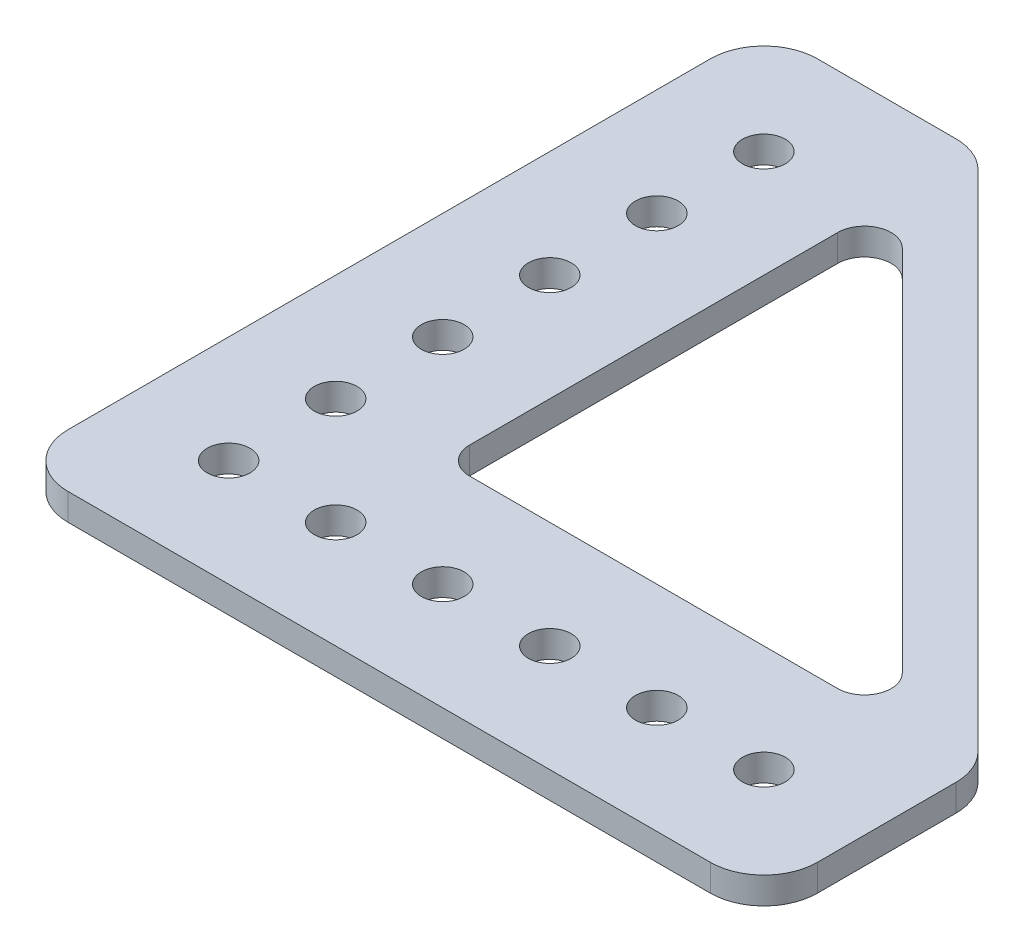
ISO-10303-21;
HEADER;
FILE_DESCRIPTION(('STEP AP214'),'2;1');
FILE_NAME('part.step','',(''),(''),'','','');
FILE_SCHEMA(('AUTOMOTIVE_DESIGN { 1 0 10303 214 1 1 1 1 }'));
ENDSEC;
DATA;
#1=APPLICATION_CONTEXT('core data for automotive mechanical design processes');
#2=APPLICATION_PROTOCOL_DEFINITION('international standard','automotive_design',2000,#1);
#3=PRODUCT_CONTEXT('',#1,'mechanical');
#4=PRODUCT('Part','Part','',(#3));
#5=PRODUCT_RELATED_PRODUCT_CATEGORY('part','',(#4));
#6=PRODUCT_DEFINITION_FORMATION('','',#4);
#7=PRODUCT_DEFINITION_CONTEXT('part definition',#1,'design');
#8=PRODUCT_DEFINITION('design','',#6,#7);
#9=PRODUCT_DEFINITION_SHAPE('','',#8);
#10=(LENGTH_UNIT() NAMED_UNIT(*) SI_UNIT(.MILLI.,.METRE.));
#11=(NAMED_UNIT(*) PLANE_ANGLE_UNIT() SI_UNIT($,.RADIAN.));
#12=(NAMED_UNIT(*) SI_UNIT($,.STERADIAN.) SOLID_ANGLE_UNIT());
#13=UNCERTAINTY_MEASURE_WITH_UNIT(LENGTH_MEASURE(1.E-05),#10,'distance_accuracy_value','');
#14=(GEOMETRIC_REPRESENTATION_CONTEXT(3) GLOBAL_UNCERTAINTY_ASSIGNED_CONTEXT((#13)) GLOBAL_UNIT_ASSIGNED_CONTEXT((#10,
#11,#12)) REPRESENTATION_CONTEXT('',''));
#15=CARTESIAN_POINT('',(0.,0.,0.));
#16=DIRECTION('',(0.,0.,1.));
#17=DIRECTION('',(1.,0.,0.));
#18=AXIS2_PLACEMENT_3D('',#15,#16,#17);
#19=CARTESIAN_POINT('',(0.,3.175,0.));
#20=DIRECTION('',(0.,1.,0.));
#21=DIRECTION('',(0.,0.,1.));
#22=AXIS2_PLACEMENT_3D('',#19,#20,#21);
#23=PLANE('',#22);
#24=CARTESIAN_POINT('',(12.7,3.175,-63.5));
#25=DIRECTION('',(0.,1.,0.));
#26=DIRECTION('',(0.,0.,1.));
#27=AXIS2_PLACEMENT_3D('',#24,#25,#26);
#28=CIRCLE('',#27,2.54);
#29=CARTESIAN_POINT('',(12.7,3.175,-60.96));
#30=VERTEX_POINT('',#29);
#31=EDGE_CURVE('E681',#30,#30,#28,.T.);
#32=ORIENTED_EDGE('',*,*,#31,.F.);
#33=EDGE_LOOP('',(#32));
#34=FACE_BOUND('',#33,.T.);
#35=CARTESIAN_POINT('',(12.7,3.175,-38.1));
#36=DIRECTION('',(0.,1.,0.));
#37=DIRECTION('',(0.,0.,1.));
#38=AXIS2_PLACEMENT_3D('',#35,#36,#37);
#39=CIRCLE('',#38,2.54);
#40=CARTESIAN_POINT('',(12.7,3.175,-35.56));
#41=VERTEX_POINT('',#40);
#42=EDGE_CURVE('E693',#41,#41,#39,.T.);
#43=ORIENTED_EDGE('',*,*,#42,.F.);
#44=EDGE_LOOP('',(#43));
#45=FACE_BOUND('',#44,.T.);
#46=CARTESIAN_POINT('',(76.2,3.175,-12.7));
#47=DIRECTION('',(0.,1.,0.));
#48=DIRECTION('',(0.,0.,1.));
#49=AXIS2_PLACEMENT_3D('',#46,#47,#48);
#50=CIRCLE('',#49,2.54);
#51=CARTESIAN_POINT('',(76.2,3.175,-10.16));
#52=VERTEX_POINT('',#51);
#53=EDGE_CURVE('E705',#52,#52,#50,.T.);
#54=ORIENTED_EDGE('',*,*,#53,.F.);
#55=EDGE_LOOP('',(#54));
#56=FACE_BOUND('',#55,.T.);
#57=CARTESIAN_POINT('',(50.8,3.175,-12.7));
#58=DIRECTION('',(0.,1.,0.));
#59=DIRECTION('',(0.,0.,1.));
#60=AXIS2_PLACEMENT_3D('',#57,#58,#59);
#61=CIRCLE('',#60,2.54);
#62=CARTESIAN_POINT('',(50.8,3.175,-10.16));
#63=VERTEX_POINT('',#62);
#64=EDGE_CURVE('E717',#63,#63,#61,.T.);
#65=ORIENTED_EDGE('',*,*,#64,.F.);
#66=EDGE_LOOP('',(#65));
#67=FACE_BOUND('',#66,.T.);
#68=CARTESIAN_POINT('',(25.4,3.175,-12.7));
#69=DIRECTION('',(0.,1.,0.));
#70=DIRECTION('',(0.,0.,1.));
#71=AXIS2_PLACEMENT_3D('',#68,#69,#70);
#72=CIRCLE('',#71,2.54);
#73=CARTESIAN_POINT('',(25.4,3.175,-10.16));
#74=VERTEX_POINT('',#73);
#75=EDGE_CURVE('E729',#74,#74,#72,.T.);
#76=ORIENTED_EDGE('',*,*,#75,.F.);
#77=EDGE_LOOP('',(#76));
#78=FACE_BOUND('',#77,.T.);
#79=DIRECTION('',(-0.707106781186548,0.,-0.707106781186548));
#80=VECTOR('',#79,1.);
#81=CARTESIAN_POINT('',(25.4,3.175,-79.9197438789308));
#82=LINE('',#81,#80);
#83=CARTESIAN_POINT('',(74.4996798486636,3.175,-30.8200640302673));
#84=VERTEX_POINT('',#83);
#85=CARTESIAN_POINT('',(30.8200640302673,3.175,-74.4996798486636));
#86=VERTEX_POINT('',#85);
#87=EDGE_CURVE('E194',#84,#86,#82,.T.);
#88=ORIENTED_EDGE('',*,*,#87,.F.);
#89=CARTESIAN_POINT('',(72.2546158183962,3.175,-28.575));
#90=DIRECTION('',(0.,1.,0.));
#91=DIRECTION('',(0.,0.,1.));
#92=AXIS2_PLACEMENT_3D('',#89,#90,#91);
#93=CIRCLE('',#92,3.175);
#94=CARTESIAN_POINT('',(72.2546158183962,3.175,-25.4));
#95=VERTEX_POINT('',#94);
#96=EDGE_CURVE('E262',#84,#95,#93,.F.);
#97=ORIENTED_EDGE('',*,*,#96,.T.);
#98=DIRECTION('',(1.,0.,0.));
#99=VECTOR('',#98,1.);
#100=CARTESIAN_POINT('',(25.4,3.175,-25.4));
#101=LINE('',#100,#99);
#102=CARTESIAN_POINT('',(28.575,3.175,-25.4));
#103=VERTEX_POINT('',#102);
#104=EDGE_CURVE('E275',#103,#95,#101,.T.);
#105=ORIENTED_EDGE('',*,*,#104,.F.);
#106=CARTESIAN_POINT('',(28.575,3.175,-28.575));
#107=DIRECTION('',(0.,1.,0.));
#108=DIRECTION('',(0.,0.,1.));
#109=AXIS2_PLACEMENT_3D('',#106,#107,#108);
#110=CIRCLE('',#109,3.175);
#111=CARTESIAN_POINT('',(25.4,3.175,-28.575));
#112=VERTEX_POINT('',#111);
#113=EDGE_CURVE('E258',#103,#112,#110,.F.);
#114=ORIENTED_EDGE('',*,*,#113,.T.);
#115=DIRECTION('',(0.,0.,1.));
#116=VECTOR('',#115,1.);
#117=CARTESIAN_POINT('',(25.4,3.175,-25.4));
#118=LINE('',#117,#116);
#119=CARTESIAN_POINT('',(25.4,3.175,-72.2546158183962));
#120=VERTEX_POINT('',#119);
#121=EDGE_CURVE('E187',#120,#112,#118,.T.);
#122=ORIENTED_EDGE('',*,*,#121,.F.);
#123=CARTESIAN_POINT('',(28.575,3.175,-72.2546158183963));
#124=DIRECTION('',(0.,1.,0.));
#125=DIRECTION('',(0.,0.,1.));
#126=AXIS2_PLACEMENT_3D('',#123,#124,#125);
#127=CIRCLE('',#126,3.175);
#128=EDGE_CURVE('E12',#120,#86,#127,.F.);
#129=ORIENTED_EDGE('',*,*,#128,.T.);
#130=EDGE_LOOP('',(#88,#97,#105,#114,#122,#129));
#131=FACE_BOUND('',#130,.T.);
#132=DIRECTION('',(0.,0.,1.));
#133=VECTOR('',#132,1.);
#134=CARTESIAN_POINT('',(0.,3.175,0.));
#135=LINE('',#134,#133);
#136=CARTESIAN_POINT('',(0.,3.175,-82.55));
#137=VERTEX_POINT('',#136);
#138=CARTESIAN_POINT('',(0.,3.175,-6.35));
#139=VERTEX_POINT('',#138);
#140=EDGE_CURVE('E197',#137,#139,#135,.T.);
#141=ORIENTED_EDGE('',*,*,#140,.T.);
#142=CARTESIAN_POINT('',(6.35,3.175,-6.35));
#143=DIRECTION('',(0.,1.,0.));
#144=DIRECTION('',(0.,0.,1.));
#145=AXIS2_PLACEMENT_3D('',#142,#143,#144);
#146=CIRCLE('',#145,6.35);
#147=CARTESIAN_POINT('',(6.35,3.175,0.));
#148=VERTEX_POINT('',#147);
#149=EDGE_CURVE('E225',#139,#148,#146,.T.);
#150=ORIENTED_EDGE('',*,*,#149,.T.);
#151=DIRECTION('',(1.,0.,0.));
#152=VECTOR('',#151,1.);
#153=CARTESIAN_POINT('',(0.,3.175,0.));
#154=LINE('',#153,#152);
#155=CARTESIAN_POINT('',(82.55,3.175,0.));
#156=VERTEX_POINT('',#155);
#157=EDGE_CURVE('E179',#148,#156,#154,.T.);
#158=ORIENTED_EDGE('',*,*,#157,.T.);
#159=CARTESIAN_POINT('',(82.55,3.175,-6.35));
#160=DIRECTION('',(0.,1.,0.));
#161=DIRECTION('',(0.,0.,1.));
#162=AXIS2_PLACEMENT_3D('',#159,#160,#161);
#163=CIRCLE('',#162,6.35);
#164=CARTESIAN_POINT('',(88.9,3.175,-6.35));
#165=VERTEX_POINT('',#164);
#166=EDGE_CURVE('E223',#156,#165,#163,.T.);
#167=ORIENTED_EDGE('',*,*,#166,.T.);
#168=DIRECTION('',(0.,0.,-1.));
#169=VECTOR('',#168,1.);
#170=CARTESIAN_POINT('',(88.9,3.175,0.));
#171=LINE('',#170,#169);
#172=CARTESIAN_POINT('',(88.9,3.175,-22.7697438789308));
#173=VERTEX_POINT('',#172);
#174=EDGE_CURVE('E290',#165,#173,#171,.T.);
#175=ORIENTED_EDGE('',*,*,#174,.T.);
#176=CARTESIAN_POINT('',(82.55,3.175,-22.7697438789308));
#177=DIRECTION('',(0.,1.,0.));
#178=DIRECTION('',(0.,0.,1.));
#179=AXIS2_PLACEMENT_3D('',#176,#177,#178);
#180=CIRCLE('',#179,6.35);
#181=CARTESIAN_POINT('',(87.0401280605346,3.175,-27.2598719394654));
#182=VERTEX_POINT('',#181);
#183=EDGE_CURVE('E221',#173,#182,#180,.T.);
#184=ORIENTED_EDGE('',*,*,#183,.T.);
#185=DIRECTION('',(-0.707106781186548,0.,-0.707106781186548));
#186=VECTOR('',#185,1.);
#187=CARTESIAN_POINT('',(25.4,3.175,-88.9));
#188=LINE('',#187,#186);
#189=CARTESIAN_POINT('',(27.2598719394654,3.175,-87.0401280605346));
#190=VERTEX_POINT('',#189);
#191=EDGE_CURVE('E292',#182,#190,#188,.T.);
#192=ORIENTED_EDGE('',*,*,#191,.T.);
#193=CARTESIAN_POINT('',(22.7697438789308,3.175,-82.55));
#194=DIRECTION('',(0.,1.,0.));
#195=DIRECTION('',(0.,0.,1.));
#196=AXIS2_PLACEMENT_3D('',#193,#194,#195);
#197=CIRCLE('',#196,6.35);
#198=CARTESIAN_POINT('',(22.7697438789308,3.175,-88.9));
#199=VERTEX_POINT('',#198);
#200=EDGE_CURVE('E219',#190,#199,#197,.T.);
#201=ORIENTED_EDGE('',*,*,#200,.T.);
#202=DIRECTION('',(-1.,0.,0.));
#203=VECTOR('',#202,1.);
#204=CARTESIAN_POINT('',(0.,3.175,-88.9));
#205=LINE('',#204,#203);
#206=CARTESIAN_POINT('',(6.35,3.175,-88.9));
#207=VERTEX_POINT('',#206);
#208=EDGE_CURVE('E296',#199,#207,#205,.T.);
#209=ORIENTED_EDGE('',*,*,#208,.T.);
#210=CARTESIAN_POINT('',(6.35,3.175,-82.55));
#211=DIRECTION('',(0.,1.,0.));
#212=DIRECTION('',(0.,0.,1.));
#213=AXIS2_PLACEMENT_3D('',#210,#211,#212);
#214=CIRCLE('',#213,6.35);
#215=EDGE_CURVE('E217',#207,#137,#214,.T.);
#216=ORIENTED_EDGE('',*,*,#215,.T.);
#217=EDGE_LOOP('',(#141,#150,#158,#167,#175,#184,#192,#201,#209,#216));
#218=FACE_BOUND('',#217,.T.);
#219=CARTESIAN_POINT('',(12.7,3.175,-12.7));
#220=DIRECTION('',(0.,1.,0.));
#221=DIRECTION('',(0.,0.,1.));
#222=AXIS2_PLACEMENT_3D('',#219,#220,#221);
#223=CIRCLE('',#222,2.54);
#224=CARTESIAN_POINT('',(12.7,3.175,-10.16));
#225=VERTEX_POINT('',#224);
#226=EDGE_CURVE('E287',#225,#225,#223,.T.);
#227=ORIENTED_EDGE('',*,*,#226,.F.);
#228=EDGE_LOOP('',(#227));
#229=FACE_BOUND('',#228,.T.);
#230=CARTESIAN_POINT('',(38.1,3.175,-12.7));
#231=DIRECTION('',(0.,1.,0.));
#232=DIRECTION('',(0.,0.,1.));
#233=AXIS2_PLACEMENT_3D('',#230,#231,#232);
#234=CIRCLE('',#233,2.54);
#235=CARTESIAN_POINT('',(38.1,3.175,-10.16));
#236=VERTEX_POINT('',#235);
#237=EDGE_CURVE('E723',#236,#236,#234,.T.);
#238=ORIENTED_EDGE('',*,*,#237,.F.);
#239=EDGE_LOOP('',(#238));
#240=FACE_BOUND('',#239,.T.);
#241=CARTESIAN_POINT('',(63.5,3.175,-12.7));
#242=DIRECTION('',(0.,1.,0.));
#243=DIRECTION('',(0.,0.,1.));
#244=AXIS2_PLACEMENT_3D('',#241,#242,#243);
#245=CIRCLE('',#244,2.54);
#246=CARTESIAN_POINT('',(63.5,3.175,-10.16));
#247=VERTEX_POINT('',#246);
#248=EDGE_CURVE('E711',#247,#247,#245,.T.);
#249=ORIENTED_EDGE('',*,*,#248,.F.);
#250=EDGE_LOOP('',(#249));
#251=FACE_BOUND('',#250,.T.);
#252=CARTESIAN_POINT('',(12.7,3.175,-25.4));
#253=DIRECTION('',(0.,1.,0.));
#254=DIRECTION('',(0.,0.,1.));
#255=AXIS2_PLACEMENT_3D('',#252,#253,#254);
#256=CIRCLE('',#255,2.54);
#257=CARTESIAN_POINT('',(12.7,3.175,-22.86));
#258=VERTEX_POINT('',#257);
#259=EDGE_CURVE('E699',#258,#258,#256,.T.);
#260=ORIENTED_EDGE('',*,*,#259,.F.);
#261=EDGE_LOOP('',(#260));
#262=FACE_BOUND('',#261,.T.);
#263=CARTESIAN_POINT('',(12.7,3.175,-50.8));
#264=DIRECTION('',(0.,1.,0.));
#265=DIRECTION('',(0.,0.,1.));
#266=AXIS2_PLACEMENT_3D('',#263,#264,#265);
#267=CIRCLE('',#266,2.54);
#268=CARTESIAN_POINT('',(12.7,3.175,-48.26));
#269=VERTEX_POINT('',#268);
#270=EDGE_CURVE('E687',#269,#269,#267,.T.);
#271=ORIENTED_EDGE('',*,*,#270,.F.);
#272=EDGE_LOOP('',(#271));
#273=FACE_BOUND('',#272,.T.);
#274=CARTESIAN_POINT('',(12.7,3.175,-76.2));
#275=DIRECTION('',(0.,1.,0.));
#276=DIRECTION('',(0.,0.,1.));
#277=AXIS2_PLACEMENT_3D('',#274,#275,#276);
#278=CIRCLE('',#277,2.54);
#279=CARTESIAN_POINT('',(12.7,3.175,-73.66));
#280=VERTEX_POINT('',#279);
#281=EDGE_CURVE('E672',#280,#280,#278,.T.);
#282=ORIENTED_EDGE('',*,*,#281,.F.);
#283=EDGE_LOOP('',(#282));
#284=FACE_BOUND('',#283,.T.);
#285=ADVANCED_FACE('F46',(#34,#45,#56,#67,#78,#131,#218,#229,#240,#251,#262,#273,#284),#23,.T.);
#286=CARTESIAN_POINT('',(0.,0.,0.));
#287=DIRECTION('',(0.,1.,0.));
#288=DIRECTION('',(0.,0.,1.));
#289=AXIS2_PLACEMENT_3D('',#286,#287,#288);
#290=PLANE('',#289);
#291=DIRECTION('',(1.,0.,0.));
#292=VECTOR('',#291,1.);
#293=CARTESIAN_POINT('',(0.,0.,0.));
#294=LINE('',#293,#292);
#295=CARTESIAN_POINT('',(6.35,0.,0.));
#296=VERTEX_POINT('',#295);
#297=CARTESIAN_POINT('',(82.55,0.,0.));
#298=VERTEX_POINT('',#297);
#299=EDGE_CURVE('E176',#296,#298,#294,.T.);
#300=ORIENTED_EDGE('',*,*,#299,.F.);
#301=CARTESIAN_POINT('',(6.35,0.,-6.35));
#302=DIRECTION('',(0.,1.,0.));
#303=DIRECTION('',(0.,0.,1.));
#304=AXIS2_PLACEMENT_3D('',#301,#302,#303);
#305=CIRCLE('',#304,6.35);
#306=CARTESIAN_POINT('',(0.,0.,-6.35));
#307=VERTEX_POINT('',#306);
#308=EDGE_CURVE('E159',#296,#307,#305,.F.);
#309=ORIENTED_EDGE('',*,*,#308,.T.);
#310=DIRECTION('',(0.,0.,1.));
#311=VECTOR('',#310,1.);
#312=CARTESIAN_POINT('',(0.,0.,0.));
#313=LINE('',#312,#311);
#314=CARTESIAN_POINT('',(0.,0.,-82.55));
#315=VERTEX_POINT('',#314);
#316=EDGE_CURVE('E205',#315,#307,#313,.T.);
#317=ORIENTED_EDGE('',*,*,#316,.F.);
#318=CARTESIAN_POINT('',(6.35,0.,-82.55));
#319=DIRECTION('',(0.,1.,0.));
#320=DIRECTION('',(0.,0.,1.));
#321=AXIS2_PLACEMENT_3D('',#318,#319,#320);
#322=CIRCLE('',#321,6.35);
#323=CARTESIAN_POINT('',(6.35,0.,-88.9));
#324=VERTEX_POINT('',#323);
#325=EDGE_CURVE('E180',#315,#324,#322,.F.);
#326=ORIENTED_EDGE('',*,*,#325,.T.);
#327=DIRECTION('',(-1.,0.,0.));
#328=VECTOR('',#327,1.);
#329=CARTESIAN_POINT('',(0.,0.,-88.9));
#330=LINE('',#329,#328);
#331=CARTESIAN_POINT('',(22.7697438789308,0.,-88.9));
#332=VERTEX_POINT('',#331);
#333=EDGE_CURVE('E202',#332,#324,#330,.T.);
#334=ORIENTED_EDGE('',*,*,#333,.F.);
#335=CARTESIAN_POINT('',(22.7697438789308,0.,-82.55));
#336=DIRECTION('',(0.,1.,0.));
#337=DIRECTION('',(0.,0.,1.));
#338=AXIS2_PLACEMENT_3D('',#335,#336,#337);
#339=CIRCLE('',#338,6.35);
#340=CARTESIAN_POINT('',(27.2598719394654,0.,-87.0401280605346));
#341=VERTEX_POINT('',#340);
#342=EDGE_CURVE('E209',#332,#341,#339,.F.);
#343=ORIENTED_EDGE('',*,*,#342,.T.);
#344=DIRECTION('',(-0.707106781186548,0.,-0.707106781186548));
#345=VECTOR('',#344,1.);
#346=CARTESIAN_POINT('',(25.4,0.,-88.9));
#347=LINE('',#346,#345);
#348=CARTESIAN_POINT('',(87.0401280605346,0.,-27.2598719394654));
#349=VERTEX_POINT('',#348);
#350=EDGE_CURVE('E190',#349,#341,#347,.T.);
#351=ORIENTED_EDGE('',*,*,#350,.F.);
#352=CARTESIAN_POINT('',(82.55,0.,-22.7697438789308));
#353=DIRECTION('',(0.,1.,0.));
#354=DIRECTION('',(0.,0.,1.));
#355=AXIS2_PLACEMENT_3D('',#352,#353,#354);
#356=CIRCLE('',#355,6.35);
#357=CARTESIAN_POINT('',(88.9,0.,-22.7697438789308));
#358=VERTEX_POINT('',#357);
#359=EDGE_CURVE('E211',#349,#358,#356,.F.);
#360=ORIENTED_EDGE('',*,*,#359,.T.);
#361=DIRECTION('',(0.,0.,-1.));
#362=VECTOR('',#361,1.);
#363=CARTESIAN_POINT('',(88.9,0.,0.));
#364=LINE('',#363,#362);
#365=CARTESIAN_POINT('',(88.9,0.,-6.35));
#366=VERTEX_POINT('',#365);
#367=EDGE_CURVE('E186',#366,#358,#364,.T.);
#368=ORIENTED_EDGE('',*,*,#367,.F.);
#369=CARTESIAN_POINT('',(82.55,0.,-6.35));
#370=DIRECTION('',(0.,1.,0.));
#371=DIRECTION('',(0.,0.,1.));
#372=AXIS2_PLACEMENT_3D('',#369,#370,#371);
#373=CIRCLE('',#372,6.35);
#374=EDGE_CURVE('E170',#366,#298,#373,.F.);
#375=ORIENTED_EDGE('',*,*,#374,.T.);
#376=EDGE_LOOP('',(#300,#309,#317,#326,#334,#343,#351,#360,#368,#375));
#377=FACE_BOUND('',#376,.T.);
#378=DIRECTION('',(0.,0.,1.));
#379=VECTOR('',#378,1.);
#380=CARTESIAN_POINT('',(25.4,0.,-25.4));
#381=LINE('',#380,#379);
#382=CARTESIAN_POINT('',(25.4,0.,-72.2546158183962));
#383=VERTEX_POINT('',#382);
#384=CARTESIAN_POINT('',(25.4,0.,-28.575));
#385=VERTEX_POINT('',#384);
#386=EDGE_CURVE('E267',#383,#385,#381,.T.);
#387=ORIENTED_EDGE('',*,*,#386,.T.);
#388=CARTESIAN_POINT('',(28.575,0.,-28.575));
#389=DIRECTION('',(0.,1.,0.));
#390=DIRECTION('',(0.,0.,1.));
#391=AXIS2_PLACEMENT_3D('',#388,#389,#390);
#392=CIRCLE('',#391,3.175);
#393=CARTESIAN_POINT('',(28.575,0.,-25.4));
#394=VERTEX_POINT('',#393);
#395=EDGE_CURVE('E256',#385,#394,#392,.T.);
#396=ORIENTED_EDGE('',*,*,#395,.T.);
#397=DIRECTION('',(1.,0.,0.));
#398=VECTOR('',#397,1.);
#399=CARTESIAN_POINT('',(25.4,0.,-25.4));
#400=LINE('',#399,#398);
#401=CARTESIAN_POINT('',(72.2546158183962,0.,-25.4));
#402=VERTEX_POINT('',#401);
#403=EDGE_CURVE('E284',#394,#402,#400,.T.);
#404=ORIENTED_EDGE('',*,*,#403,.T.);
#405=CARTESIAN_POINT('',(72.2546158183962,0.,-28.575));
#406=DIRECTION('',(0.,1.,0.));
#407=DIRECTION('',(0.,0.,1.));
#408=AXIS2_PLACEMENT_3D('',#405,#406,#407);
#409=CIRCLE('',#408,3.175);
#410=CARTESIAN_POINT('',(74.4996798486636,0.,-30.8200640302673));
#411=VERTEX_POINT('',#410);
#412=EDGE_CURVE('E260',#402,#411,#409,.T.);
#413=ORIENTED_EDGE('',*,*,#412,.T.);
#414=DIRECTION('',(-0.707106781186548,0.,-0.707106781186548));
#415=VECTOR('',#414,1.);
#416=CARTESIAN_POINT('',(25.4,0.,-79.9197438789308));
#417=LINE('',#416,#415);
#418=CARTESIAN_POINT('',(30.8200640302673,0.,-74.4996798486636));
#419=VERTEX_POINT('',#418);
#420=EDGE_CURVE('E268',#411,#419,#417,.T.);
#421=ORIENTED_EDGE('',*,*,#420,.T.);
#422=CARTESIAN_POINT('',(28.575,0.,-72.2546158183963));
#423=DIRECTION('',(0.,1.,0.));
#424=DIRECTION('',(0.,0.,1.));
#425=AXIS2_PLACEMENT_3D('',#422,#423,#424);
#426=CIRCLE('',#425,3.175);
#427=EDGE_CURVE('E54',#419,#383,#426,.T.);
#428=ORIENTED_EDGE('',*,*,#427,.T.);
#429=EDGE_LOOP('',(#387,#396,#404,#413,#421,#428));
#430=FACE_BOUND('',#429,.T.);
#431=CARTESIAN_POINT('',(12.7,0.,-12.7));
#432=DIRECTION('',(0.,1.,0.));
#433=DIRECTION('',(0.,0.,1.));
#434=AXIS2_PLACEMENT_3D('',#431,#432,#433);
#435=CIRCLE('',#434,2.54);
#436=CARTESIAN_POINT('',(12.7,0.,-10.16));
#437=VERTEX_POINT('',#436);
#438=EDGE_CURVE('E732',#437,#437,#435,.T.);
#439=ORIENTED_EDGE('',*,*,#438,.T.);
#440=EDGE_LOOP('',(#439));
#441=FACE_BOUND('',#440,.T.);
#442=CARTESIAN_POINT('',(25.4,0.,-12.7));
#443=DIRECTION('',(0.,1.,0.));
#444=DIRECTION('',(0.,0.,1.));
#445=AXIS2_PLACEMENT_3D('',#442,#443,#444);
#446=CIRCLE('',#445,2.54);
#447=CARTESIAN_POINT('',(25.4,0.,-10.16));
#448=VERTEX_POINT('',#447);
#449=EDGE_CURVE('E726',#448,#448,#446,.T.);
#450=ORIENTED_EDGE('',*,*,#449,.T.);
#451=EDGE_LOOP('',(#450));
#452=FACE_BOUND('',#451,.T.);
#453=CARTESIAN_POINT('',(38.1,0.,-12.7));
#454=DIRECTION('',(0.,1.,0.));
#455=DIRECTION('',(0.,0.,1.));
#456=AXIS2_PLACEMENT_3D('',#453,#454,#455);
#457=CIRCLE('',#456,2.54);
#458=CARTESIAN_POINT('',(38.1,0.,-10.16));
#459=VERTEX_POINT('',#458);
#460=EDGE_CURVE('E720',#459,#459,#457,.T.);
#461=ORIENTED_EDGE('',*,*,#460,.T.);
#462=EDGE_LOOP('',(#461));
#463=FACE_BOUND('',#462,.T.);
#464=CARTESIAN_POINT('',(50.8,0.,-12.7));
#465=DIRECTION('',(0.,1.,0.));
#466=DIRECTION('',(0.,0.,1.));
#467=AXIS2_PLACEMENT_3D('',#464,#465,#466);
#468=CIRCLE('',#467,2.54);
#469=CARTESIAN_POINT('',(50.8,0.,-10.16));
#470=VERTEX_POINT('',#469);
#471=EDGE_CURVE('E714',#470,#470,#468,.T.);
#472=ORIENTED_EDGE('',*,*,#471,.T.);
#473=EDGE_LOOP('',(#472));
#474=FACE_BOUND('',#473,.T.);
#475=CARTESIAN_POINT('',(63.5,0.,-12.7));
#476=DIRECTION('',(0.,1.,0.));
#477=DIRECTION('',(0.,0.,1.));
#478=AXIS2_PLACEMENT_3D('',#475,#476,#477);
#479=CIRCLE('',#478,2.54);
#480=CARTESIAN_POINT('',(63.5,0.,-10.16));
#481=VERTEX_POINT('',#480);
#482=EDGE_CURVE('E708',#481,#481,#479,.T.);
#483=ORIENTED_EDGE('',*,*,#482,.T.);
#484=EDGE_LOOP('',(#483));
#485=FACE_BOUND('',#484,.T.);
#486=CARTESIAN_POINT('',(76.2,0.,-12.7));
#487=DIRECTION('',(0.,1.,0.));
#488=DIRECTION('',(0.,0.,1.));
#489=AXIS2_PLACEMENT_3D('',#486,#487,#488);
#490=CIRCLE('',#489,2.54);
#491=CARTESIAN_POINT('',(76.2,0.,-10.16));
#492=VERTEX_POINT('',#491);
#493=EDGE_CURVE('E702',#492,#492,#490,.T.);
#494=ORIENTED_EDGE('',*,*,#493,.T.);
#495=EDGE_LOOP('',(#494));
#496=FACE_BOUND('',#495,.T.);
#497=CARTESIAN_POINT('',(12.7,0.,-25.4));
#498=DIRECTION('',(0.,1.,0.));
#499=DIRECTION('',(0.,0.,1.));
#500=AXIS2_PLACEMENT_3D('',#497,#498,#499);
#501=CIRCLE('',#500,2.54);
#502=CARTESIAN_POINT('',(12.7,0.,-22.86));
#503=VERTEX_POINT('',#502);
#504=EDGE_CURVE('E696',#503,#503,#501,.T.);
#505=ORIENTED_EDGE('',*,*,#504,.T.);
#506=EDGE_LOOP('',(#505));
#507=FACE_BOUND('',#506,.T.);
#508=CARTESIAN_POINT('',(12.7,0.,-38.1));
#509=DIRECTION('',(0.,1.,0.));
#510=DIRECTION('',(0.,0.,1.));
#511=AXIS2_PLACEMENT_3D('',#508,#509,#510);
#512=CIRCLE('',#511,2.54);
#513=CARTESIAN_POINT('',(12.7,0.,-35.56));
#514=VERTEX_POINT('',#513);
#515=EDGE_CURVE('E690',#514,#514,#512,.T.);
#516=ORIENTED_EDGE('',*,*,#515,.T.);
#517=EDGE_LOOP('',(#516));
#518=FACE_BOUND('',#517,.T.);
#519=CARTESIAN_POINT('',(12.7,0.,-50.8));
#520=DIRECTION('',(0.,1.,0.));
#521=DIRECTION('',(0.,0.,1.));
#522=AXIS2_PLACEMENT_3D('',#519,#520,#521);
#523=CIRCLE('',#522,2.54);
#524=CARTESIAN_POINT('',(12.7,0.,-48.26));
#525=VERTEX_POINT('',#524);
#526=EDGE_CURVE('E684',#525,#525,#523,.T.);
#527=ORIENTED_EDGE('',*,*,#526,.T.);
#528=EDGE_LOOP('',(#527));
#529=FACE_BOUND('',#528,.T.);
#530=CARTESIAN_POINT('',(12.7,0.,-63.5));
#531=DIRECTION('',(0.,1.,0.));
#532=DIRECTION('',(0.,0.,1.));
#533=AXIS2_PLACEMENT_3D('',#530,#531,#532);
#534=CIRCLE('',#533,2.54);
#535=CARTESIAN_POINT('',(12.7,0.,-60.96));
#536=VERTEX_POINT('',#535);
#537=EDGE_CURVE('E678',#536,#536,#534,.T.);
#538=ORIENTED_EDGE('',*,*,#537,.T.);
#539=EDGE_LOOP('',(#538));
#540=FACE_BOUND('',#539,.T.);
#541=CARTESIAN_POINT('',(12.7,0.,-76.2));
#542=DIRECTION('',(0.,1.,0.));
#543=DIRECTION('',(0.,0.,1.));
#544=AXIS2_PLACEMENT_3D('',#541,#542,#543);
#545=CIRCLE('',#544,2.54);
#546=CARTESIAN_POINT('',(12.7,0.,-73.66));
#547=VERTEX_POINT('',#546);
#548=EDGE_CURVE('E675',#547,#547,#545,.T.);
#549=ORIENTED_EDGE('',*,*,#548,.T.);
#550=EDGE_LOOP('',(#549));
#551=FACE_BOUND('',#550,.T.);
#552=ADVANCED_FACE('F183',(#377,#430,#441,#452,#463,#474,#485,#496,#507,#518,#529,#540,#551),
#290,.F.);
#553=CARTESIAN_POINT('',(0.,3.175,0.));
#554=DIRECTION('',(0.,0.,-1.));
#555=DIRECTION('',(-1.,0.,0.));
#556=AXIS2_PLACEMENT_3D('',#553,#554,#555);
#557=PLANE('',#556);
#558=ORIENTED_EDGE('',*,*,#157,.F.);
#559=DIRECTION('',(0.,-1.,0.));
#560=VECTOR('',#559,1.);
#561=CARTESIAN_POINT('',(6.35,3.175,0.));
#562=LINE('',#561,#560);
#563=EDGE_CURVE('E163',#148,#296,#562,.T.);
#564=ORIENTED_EDGE('',*,*,#563,.T.);
#565=ORIENTED_EDGE('',*,*,#299,.T.);
#566=DIRECTION('',(0.,-1.,0.));
#567=VECTOR('',#566,1.);
#568=CARTESIAN_POINT('',(82.55,3.175,0.));
#569=LINE('',#568,#567);
#570=EDGE_CURVE('E181',#298,#156,#569,.F.);
#571=ORIENTED_EDGE('',*,*,#570,.T.);
#572=EDGE_LOOP('',(#558,#564,#565,#571));
#573=FACE_BOUND('',#572,.T.);
#574=ADVANCED_FACE('F175',(#573),#557,.F.);
#575=CARTESIAN_POINT('',(88.9,3.175,0.));
#576=DIRECTION('',(-1.,0.,0.));
#577=DIRECTION('',(0.,0.,1.));
#578=AXIS2_PLACEMENT_3D('',#575,#576,#577);
#579=PLANE('',#578);
#580=ORIENTED_EDGE('',*,*,#174,.F.);
#581=DIRECTION('',(0.,-1.,0.));
#582=VECTOR('',#581,1.);
#583=CARTESIAN_POINT('',(88.9,3.175,-6.35));
#584=LINE('',#583,#582);
#585=EDGE_CURVE('E229',#165,#366,#584,.T.);
#586=ORIENTED_EDGE('',*,*,#585,.T.);
#587=ORIENTED_EDGE('',*,*,#367,.T.);
#588=DIRECTION('',(0.,-1.,0.));
#589=VECTOR('',#588,1.);
#590=CARTESIAN_POINT('',(88.9,3.175,-22.7697438789308));
#591=LINE('',#590,#589);
#592=EDGE_CURVE('E227',#358,#173,#591,.F.);
#593=ORIENTED_EDGE('',*,*,#592,.T.);
#594=EDGE_LOOP('',(#580,#586,#587,#593));
#595=FACE_BOUND('',#594,.T.);
#596=ADVANCED_FACE('F329',(#595),#579,.F.);
#597=CARTESIAN_POINT('',(25.4,3.175,-88.9));
#598=DIRECTION('',(-0.707106781186548,0.,0.707106781186548));
#599=DIRECTION('',(0.707106781186548,0.,0.707106781186548));
#600=AXIS2_PLACEMENT_3D('',#597,#598,#599);
#601=PLANE('',#600);
#602=ORIENTED_EDGE('',*,*,#191,.F.);
#603=DIRECTION('',(0.,-1.,0.));
#604=VECTOR('',#603,1.);
#605=CARTESIAN_POINT('',(87.0401280605346,3.175,-27.2598719394654));
#606=LINE('',#605,#604);
#607=EDGE_CURVE('E234',#182,#349,#606,.T.);
#608=ORIENTED_EDGE('',*,*,#607,.T.);
#609=ORIENTED_EDGE('',*,*,#350,.T.);
#610=DIRECTION('',(0.,-1.,0.));
#611=VECTOR('',#610,1.);
#612=CARTESIAN_POINT('',(27.2598719394654,3.175,-87.0401280605346));
#613=LINE('',#612,#611);
#614=EDGE_CURVE('E232',#341,#190,#613,.F.);
#615=ORIENTED_EDGE('',*,*,#614,.T.);
#616=EDGE_LOOP('',(#602,#608,#609,#615));
#617=FACE_BOUND('',#616,.T.);
#618=ADVANCED_FACE('F321',(#617),#601,.F.);
#619=CARTESIAN_POINT('',(0.,3.175,-88.9));
#620=DIRECTION('',(0.,0.,1.));
#621=DIRECTION('',(1.,0.,0.));
#622=AXIS2_PLACEMENT_3D('',#619,#620,#621);
#623=PLANE('',#622);
#624=ORIENTED_EDGE('',*,*,#208,.F.);
#625=DIRECTION('',(0.,-1.,0.));
#626=VECTOR('',#625,1.);
#627=CARTESIAN_POINT('',(22.7697438789308,3.175,-88.9));
#628=LINE('',#627,#626);
#629=EDGE_CURVE('E239',#199,#332,#628,.T.);
#630=ORIENTED_EDGE('',*,*,#629,.T.);
#631=ORIENTED_EDGE('',*,*,#333,.T.);
#632=DIRECTION('',(0.,-1.,0.));
#633=VECTOR('',#632,1.);
#634=CARTESIAN_POINT('',(6.35,3.175,-88.9));
#635=LINE('',#634,#633);
#636=EDGE_CURVE('E237',#324,#207,#635,.F.);
#637=ORIENTED_EDGE('',*,*,#636,.T.);
#638=EDGE_LOOP('',(#624,#630,#631,#637));
#639=FACE_BOUND('',#638,.T.);
#640=ADVANCED_FACE('F312',(#639),#623,.F.);
#641=CARTESIAN_POINT('',(0.,3.175,0.));
#642=DIRECTION('',(1.,0.,0.));
#643=DIRECTION('',(0.,0.,-1.));
#644=AXIS2_PLACEMENT_3D('',#641,#642,#643);
#645=PLANE('',#644);
#646=ORIENTED_EDGE('',*,*,#316,.T.);
#647=DIRECTION('',(0.,-1.,0.));
#648=VECTOR('',#647,1.);
#649=CARTESIAN_POINT('',(0.,3.175,-6.35));
#650=LINE('',#649,#648);
#651=EDGE_CURVE('E164',#307,#139,#650,.F.);
#652=ORIENTED_EDGE('',*,*,#651,.T.);
#653=ORIENTED_EDGE('',*,*,#140,.F.);
#654=DIRECTION('',(0.,-1.,0.));
#655=VECTOR('',#654,1.);
#656=CARTESIAN_POINT('',(0.,3.175,-82.55));
#657=LINE('',#656,#655);
#658=EDGE_CURVE('E169',#137,#315,#657,.T.);
#659=ORIENTED_EDGE('',*,*,#658,.T.);
#660=EDGE_LOOP('',(#646,#652,#653,#659));
#661=FACE_BOUND('',#660,.T.);
#662=ADVANCED_FACE('F306',(#661),#645,.F.);
#663=CARTESIAN_POINT('',(25.4,3.175,-25.4));
#664=DIRECTION('',(0.,0.,-1.));
#665=DIRECTION('',(-1.,0.,0.));
#666=AXIS2_PLACEMENT_3D('',#663,#664,#665);
#667=PLANE('',#666);
#668=ORIENTED_EDGE('',*,*,#403,.F.);
#669=DIRECTION('',(0.,-1.,0.));
#670=VECTOR('',#669,1.);
#671=CARTESIAN_POINT('',(28.575,3.175,-25.4));
#672=LINE('',#671,#670);
#673=EDGE_CURVE('E250',#394,#103,#672,.F.);
#674=ORIENTED_EDGE('',*,*,#673,.T.);
#675=ORIENTED_EDGE('',*,*,#104,.T.);
#676=DIRECTION('',(0.,-1.,0.));
#677=VECTOR('',#676,1.);
#678=CARTESIAN_POINT('',(72.2546158183962,0.,-25.4));
#679=LINE('',#678,#677);
#680=EDGE_CURVE('E247',#95,#402,#679,.T.);
#681=ORIENTED_EDGE('',*,*,#680,.T.);
#682=EDGE_LOOP('',(#668,#674,#675,#681));
#683=FACE_BOUND('',#682,.T.);
#684=ADVANCED_FACE('F353',(#683),#667,.T.);
#685=CARTESIAN_POINT('',(25.4,3.175,-79.9197438789308));
#686=DIRECTION('',(-0.707106781186548,0.,0.707106781186547));
#687=DIRECTION('',(0.707106781186547,0.,0.707106781186548));
#688=AXIS2_PLACEMENT_3D('',#685,#686,#687);
#689=PLANE('',#688);
#690=ORIENTED_EDGE('',*,*,#420,.F.);
#691=DIRECTION('',(0.,-1.,0.));
#692=VECTOR('',#691,1.);
#693=CARTESIAN_POINT('',(74.4996798486635,3.175,-30.8200640302673));
#694=LINE('',#693,#692);
#695=EDGE_CURVE('E66',#411,#84,#694,.F.);
#696=ORIENTED_EDGE('',*,*,#695,.T.);
#697=ORIENTED_EDGE('',*,*,#87,.T.);
#698=DIRECTION('',(0.,-1.,0.));
#699=VECTOR('',#698,1.);
#700=CARTESIAN_POINT('',(30.8200640302673,0.,-74.4996798486636));
#701=LINE('',#700,#699);
#702=EDGE_CURVE('E252',#86,#419,#701,.T.);
#703=ORIENTED_EDGE('',*,*,#702,.T.);
#704=EDGE_LOOP('',(#690,#696,#697,#703));
#705=FACE_BOUND('',#704,.T.);
#706=ADVANCED_FACE('F277',(#705),#689,.T.);
#707=CARTESIAN_POINT('',(25.4,3.175,-25.4));
#708=DIRECTION('',(1.,0.,0.));
#709=DIRECTION('',(0.,0.,-1.));
#710=AXIS2_PLACEMENT_3D('',#707,#708,#709);
#711=PLANE('',#710);
#712=ORIENTED_EDGE('',*,*,#121,.T.);
#713=DIRECTION('',(0.,-1.,0.));
#714=VECTOR('',#713,1.);
#715=CARTESIAN_POINT('',(25.4,0.,-28.575));
#716=LINE('',#715,#714);
#717=EDGE_CURVE('E244',#112,#385,#716,.T.);
#718=ORIENTED_EDGE('',*,*,#717,.T.);
#719=ORIENTED_EDGE('',*,*,#386,.F.);
#720=DIRECTION('',(0.,-1.,0.));
#721=VECTOR('',#720,1.);
#722=CARTESIAN_POINT('',(25.4,3.175,-72.2546158183963));
#723=LINE('',#722,#721);
#724=EDGE_CURVE('E242',#383,#120,#723,.F.);
#725=ORIENTED_EDGE('',*,*,#724,.T.);
#726=EDGE_LOOP('',(#712,#718,#719,#725));
#727=FACE_BOUND('',#726,.T.);
#728=ADVANCED_FACE('F273',(#727),#711,.T.);
#729=CARTESIAN_POINT('',(12.7,3.175,-12.7));
#730=DIRECTION('',(0.,-1.,0.));
#731=DIRECTION('',(0.,0.,-1.));
#732=AXIS2_PLACEMENT_3D('',#729,#730,#731);
#733=CYLINDRICAL_SURFACE('',#732,2.54);
#734=ORIENTED_EDGE('',*,*,#226,.T.);
#735=EDGE_LOOP('',(#734));
#736=FACE_BOUND('',#735,.T.);
#737=ORIENTED_EDGE('',*,*,#438,.F.);
#738=EDGE_LOOP('',(#737));
#739=FACE_BOUND('',#738,.T.);
#740=ADVANCED_FACE('F404',(#736,#739),#733,.F.);
#741=CARTESIAN_POINT('',(25.4,3.175,-12.7));
#742=DIRECTION('',(0.,-1.,0.));
#743=DIRECTION('',(0.,0.,-1.));
#744=AXIS2_PLACEMENT_3D('',#741,#742,#743);
#745=CYLINDRICAL_SURFACE('',#744,2.54);
#746=ORIENTED_EDGE('',*,*,#75,.T.);
#747=EDGE_LOOP('',(#746));
#748=FACE_BOUND('',#747,.T.);
#749=ORIENTED_EDGE('',*,*,#449,.F.);
#750=EDGE_LOOP('',(#749));
#751=FACE_BOUND('',#750,.T.);
#752=ADVANCED_FACE('F413',(#748,#751),#745,.F.);
#753=CARTESIAN_POINT('',(38.1,3.175,-12.7));
#754=DIRECTION('',(0.,-1.,0.));
#755=DIRECTION('',(0.,0.,-1.));
#756=AXIS2_PLACEMENT_3D('',#753,#754,#755);
#757=CYLINDRICAL_SURFACE('',#756,2.54);
#758=ORIENTED_EDGE('',*,*,#237,.T.);
#759=EDGE_LOOP('',(#758));
#760=FACE_BOUND('',#759,.T.);
#761=ORIENTED_EDGE('',*,*,#460,.F.);
#762=EDGE_LOOP('',(#761));
#763=FACE_BOUND('',#762,.T.);
#764=ADVANCED_FACE('F423',(#760,#763),#757,.F.);
#765=CARTESIAN_POINT('',(50.8,3.175,-12.7));
#766=DIRECTION('',(0.,-1.,0.));
#767=DIRECTION('',(0.,0.,-1.));
#768=AXIS2_PLACEMENT_3D('',#765,#766,#767);
#769=CYLINDRICAL_SURFACE('',#768,2.54);
#770=ORIENTED_EDGE('',*,*,#64,.T.);
#771=EDGE_LOOP('',(#770));
#772=FACE_BOUND('',#771,.T.);
#773=ORIENTED_EDGE('',*,*,#471,.F.);
#774=EDGE_LOOP('',(#773));
#775=FACE_BOUND('',#774,.T.);
#776=ADVANCED_FACE('F433',(#772,#775),#769,.F.);
#777=CARTESIAN_POINT('',(63.5,3.175,-12.7));
#778=DIRECTION('',(0.,-1.,0.));
#779=DIRECTION('',(0.,0.,-1.));
#780=AXIS2_PLACEMENT_3D('',#777,#778,#779);
#781=CYLINDRICAL_SURFACE('',#780,2.54);
#782=ORIENTED_EDGE('',*,*,#248,.T.);
#783=EDGE_LOOP('',(#782));
#784=FACE_BOUND('',#783,.T.);
#785=ORIENTED_EDGE('',*,*,#482,.F.);
#786=EDGE_LOOP('',(#785));
#787=FACE_BOUND('',#786,.T.);
#788=ADVANCED_FACE('F442',(#784,#787),#781,.F.);
#789=CARTESIAN_POINT('',(76.2,3.175,-12.7));
#790=DIRECTION('',(0.,-1.,0.));
#791=DIRECTION('',(0.,0.,-1.));
#792=AXIS2_PLACEMENT_3D('',#789,#790,#791);
#793=CYLINDRICAL_SURFACE('',#792,2.54);
#794=ORIENTED_EDGE('',*,*,#53,.T.);
#795=EDGE_LOOP('',(#794));
#796=FACE_BOUND('',#795,.T.);
#797=ORIENTED_EDGE('',*,*,#493,.F.);
#798=EDGE_LOOP('',(#797));
#799=FACE_BOUND('',#798,.T.);
#800=ADVANCED_FACE('F451',(#796,#799),#793,.F.);
#801=CARTESIAN_POINT('',(12.7,3.175,-25.4));
#802=DIRECTION('',(0.,-1.,0.));
#803=DIRECTION('',(0.,0.,-1.));
#804=AXIS2_PLACEMENT_3D('',#801,#802,#803);
#805=CYLINDRICAL_SURFACE('',#804,2.54);
#806=ORIENTED_EDGE('',*,*,#259,.T.);
#807=EDGE_LOOP('',(#806));
#808=FACE_BOUND('',#807,.T.);
#809=ORIENTED_EDGE('',*,*,#504,.F.);
#810=EDGE_LOOP('',(#809));
#811=FACE_BOUND('',#810,.T.);
#812=ADVANCED_FACE('F460',(#808,#811),#805,.F.);
#813=CARTESIAN_POINT('',(12.7,3.175,-38.1));
#814=DIRECTION('',(0.,-1.,0.));
#815=DIRECTION('',(0.,0.,-1.));
#816=AXIS2_PLACEMENT_3D('',#813,#814,#815);
#817=CYLINDRICAL_SURFACE('',#816,2.54);
#818=ORIENTED_EDGE('',*,*,#42,.T.);
#819=EDGE_LOOP('',(#818));
#820=FACE_BOUND('',#819,.T.);
#821=ORIENTED_EDGE('',*,*,#515,.F.);
#822=EDGE_LOOP('',(#821));
#823=FACE_BOUND('',#822,.T.);
#824=ADVANCED_FACE('F468',(#820,#823),#817,.F.);
#825=CARTESIAN_POINT('',(12.7,3.175,-50.8));
#826=DIRECTION('',(0.,-1.,0.));
#827=DIRECTION('',(0.,0.,-1.));
#828=AXIS2_PLACEMENT_3D('',#825,#826,#827);
#829=CYLINDRICAL_SURFACE('',#828,2.54);
#830=ORIENTED_EDGE('',*,*,#270,.T.);
#831=EDGE_LOOP('',(#830));
#832=FACE_BOUND('',#831,.T.);
#833=ORIENTED_EDGE('',*,*,#526,.F.);
#834=EDGE_LOOP('',(#833));
#835=FACE_BOUND('',#834,.T.);
#836=ADVANCED_FACE('F477',(#832,#835),#829,.F.);
#837=CARTESIAN_POINT('',(12.7,3.175,-63.5));
#838=DIRECTION('',(0.,-1.,0.));
#839=DIRECTION('',(0.,0.,-1.));
#840=AXIS2_PLACEMENT_3D('',#837,#838,#839);
#841=CYLINDRICAL_SURFACE('',#840,2.54);
#842=ORIENTED_EDGE('',*,*,#31,.T.);
#843=EDGE_LOOP('',(#842));
#844=FACE_BOUND('',#843,.T.);
#845=ORIENTED_EDGE('',*,*,#537,.F.);
#846=EDGE_LOOP('',(#845));
#847=FACE_BOUND('',#846,.T.);
#848=ADVANCED_FACE('F486',(#844,#847),#841,.F.);
#849=CARTESIAN_POINT('',(12.7,3.175,-76.2));
#850=DIRECTION('',(0.,-1.,0.));
#851=DIRECTION('',(0.,0.,-1.));
#852=AXIS2_PLACEMENT_3D('',#849,#850,#851);
#853=CYLINDRICAL_SURFACE('',#852,2.54);
#854=ORIENTED_EDGE('',*,*,#281,.T.);
#855=EDGE_LOOP('',(#854));
#856=FACE_BOUND('',#855,.T.);
#857=ORIENTED_EDGE('',*,*,#548,.F.);
#858=EDGE_LOOP('',(#857));
#859=FACE_BOUND('',#858,.T.);
#860=ADVANCED_FACE('F341',(#856,#859),#853,.F.);
#861=CARTESIAN_POINT('',(6.35,3.175,-6.35));
#862=DIRECTION('',(0.,-1.,0.));
#863=DIRECTION('',(0.,0.,-1.));
#864=AXIS2_PLACEMENT_3D('',#861,#862,#863);
#865=CYLINDRICAL_SURFACE('',#864,6.35);
#866=ORIENTED_EDGE('',*,*,#149,.F.);
#867=ORIENTED_EDGE('',*,*,#651,.F.);
#868=ORIENTED_EDGE('',*,*,#308,.F.);
#869=ORIENTED_EDGE('',*,*,#563,.F.);
#870=EDGE_LOOP('',(#866,#867,#868,#869));
#871=FACE_BOUND('',#870,.T.);
#872=ADVANCED_FACE('F162',(#871),#865,.T.);
#873=CARTESIAN_POINT('',(82.55,3.175,-6.35));
#874=DIRECTION('',(0.,-1.,0.));
#875=DIRECTION('',(0.,0.,-1.));
#876=AXIS2_PLACEMENT_3D('',#873,#874,#875);
#877=CYLINDRICAL_SURFACE('',#876,6.35);
#878=ORIENTED_EDGE('',*,*,#166,.F.);
#879=ORIENTED_EDGE('',*,*,#570,.F.);
#880=ORIENTED_EDGE('',*,*,#374,.F.);
#881=ORIENTED_EDGE('',*,*,#585,.F.);
#882=EDGE_LOOP('',(#878,#879,#880,#881));
#883=FACE_BOUND('',#882,.T.);
#884=ADVANCED_FACE('F333',(#883),#877,.T.);
#885=CARTESIAN_POINT('',(82.55,3.175,-22.7697438789308));
#886=DIRECTION('',(0.,-1.,0.));
#887=DIRECTION('',(0.,0.,-1.));
#888=AXIS2_PLACEMENT_3D('',#885,#886,#887);
#889=CYLINDRICAL_SURFACE('',#888,6.35);
#890=ORIENTED_EDGE('',*,*,#183,.F.);
#891=ORIENTED_EDGE('',*,*,#592,.F.);
#892=ORIENTED_EDGE('',*,*,#359,.F.);
#893=ORIENTED_EDGE('',*,*,#607,.F.);
#894=EDGE_LOOP('',(#890,#891,#892,#893));
#895=FACE_BOUND('',#894,.T.);
#896=ADVANCED_FACE('F325',(#895),#889,.T.);
#897=CARTESIAN_POINT('',(22.7697438789308,3.175,-82.55));
#898=DIRECTION('',(0.,-1.,0.));
#899=DIRECTION('',(0.,0.,-1.));
#900=AXIS2_PLACEMENT_3D('',#897,#898,#899);
#901=CYLINDRICAL_SURFACE('',#900,6.35);
#902=ORIENTED_EDGE('',*,*,#200,.F.);
#903=ORIENTED_EDGE('',*,*,#614,.F.);
#904=ORIENTED_EDGE('',*,*,#342,.F.);
#905=ORIENTED_EDGE('',*,*,#629,.F.);
#906=EDGE_LOOP('',(#902,#903,#904,#905));
#907=FACE_BOUND('',#906,.T.);
#908=ADVANCED_FACE('F316',(#907),#901,.T.);
#909=CARTESIAN_POINT('',(6.35,3.175,-82.55));
#910=DIRECTION('',(0.,-1.,0.));
#911=DIRECTION('',(0.,0.,-1.));
#912=AXIS2_PLACEMENT_3D('',#909,#910,#911);
#913=CYLINDRICAL_SURFACE('',#912,6.35);
#914=ORIENTED_EDGE('',*,*,#215,.F.);
#915=ORIENTED_EDGE('',*,*,#636,.F.);
#916=ORIENTED_EDGE('',*,*,#325,.F.);
#917=ORIENTED_EDGE('',*,*,#658,.F.);
#918=EDGE_LOOP('',(#914,#915,#916,#917));
#919=FACE_BOUND('',#918,.T.);
#920=ADVANCED_FACE('F308',(#919),#913,.T.);
#921=CARTESIAN_POINT('',(28.575,3.175,-28.575));
#922=DIRECTION('',(0.,1.,0.));
#923=DIRECTION('',(0.,0.,1.));
#924=AXIS2_PLACEMENT_3D('',#921,#922,#923);
#925=CYLINDRICAL_SURFACE('',#924,3.175);
#926=ORIENTED_EDGE('',*,*,#113,.F.);
#927=ORIENTED_EDGE('',*,*,#673,.F.);
#928=ORIENTED_EDGE('',*,*,#395,.F.);
#929=ORIENTED_EDGE('',*,*,#717,.F.);
#930=EDGE_LOOP('',(#926,#927,#928,#929));
#931=FACE_BOUND('',#930,.T.);
#932=ADVANCED_FACE('F535',(#931),#925,.F.);
#933=CARTESIAN_POINT('',(72.2546158183962,3.175,-28.575));
#934=DIRECTION('',(0.,1.,0.));
#935=DIRECTION('',(0.,0.,1.));
#936=AXIS2_PLACEMENT_3D('',#933,#934,#935);
#937=CYLINDRICAL_SURFACE('',#936,3.175);
#938=ORIENTED_EDGE('',*,*,#96,.F.);
#939=ORIENTED_EDGE('',*,*,#695,.F.);
#940=ORIENTED_EDGE('',*,*,#412,.F.);
#941=ORIENTED_EDGE('',*,*,#680,.F.);
#942=EDGE_LOOP('',(#938,#939,#940,#941));
#943=FACE_BOUND('',#942,.T.);
#944=ADVANCED_FACE('F638',(#943),#937,.F.);
#945=CARTESIAN_POINT('',(28.575,3.175,-72.2546158183963));
#946=DIRECTION('',(0.,1.,0.));
#947=DIRECTION('',(0.,0.,1.));
#948=AXIS2_PLACEMENT_3D('',#945,#946,#947);
#949=CYLINDRICAL_SURFACE('',#948,3.175);
#950=ORIENTED_EDGE('',*,*,#128,.F.);
#951=ORIENTED_EDGE('',*,*,#724,.F.);
#952=ORIENTED_EDGE('',*,*,#427,.F.);
#953=ORIENTED_EDGE('',*,*,#702,.F.);
#954=EDGE_LOOP('',(#950,#951,#952,#953));
#955=FACE_BOUND('',#954,.T.);
#956=ADVANCED_FACE('F48',(#955),#949,.F.);
#957=CLOSED_SHELL('',(#285,#552,#574,#596,#618,#640,#662,#684,#706,#728,#740,#752,#764,#776,
#788,#800,#812,#824,#836,#848,#860,#872,#884,#896,#908,#920,#932,#944,#956));
#958=MANIFOLD_SOLID_BREP('B2',#957);
#959=ADVANCED_BREP_SHAPE_REPRESENTATION('',(#18,#958),#14);
#960=SHAPE_DEFINITION_REPRESENTATION(#9,#959);
ENDSEC;
END-ISO-10303-21;
